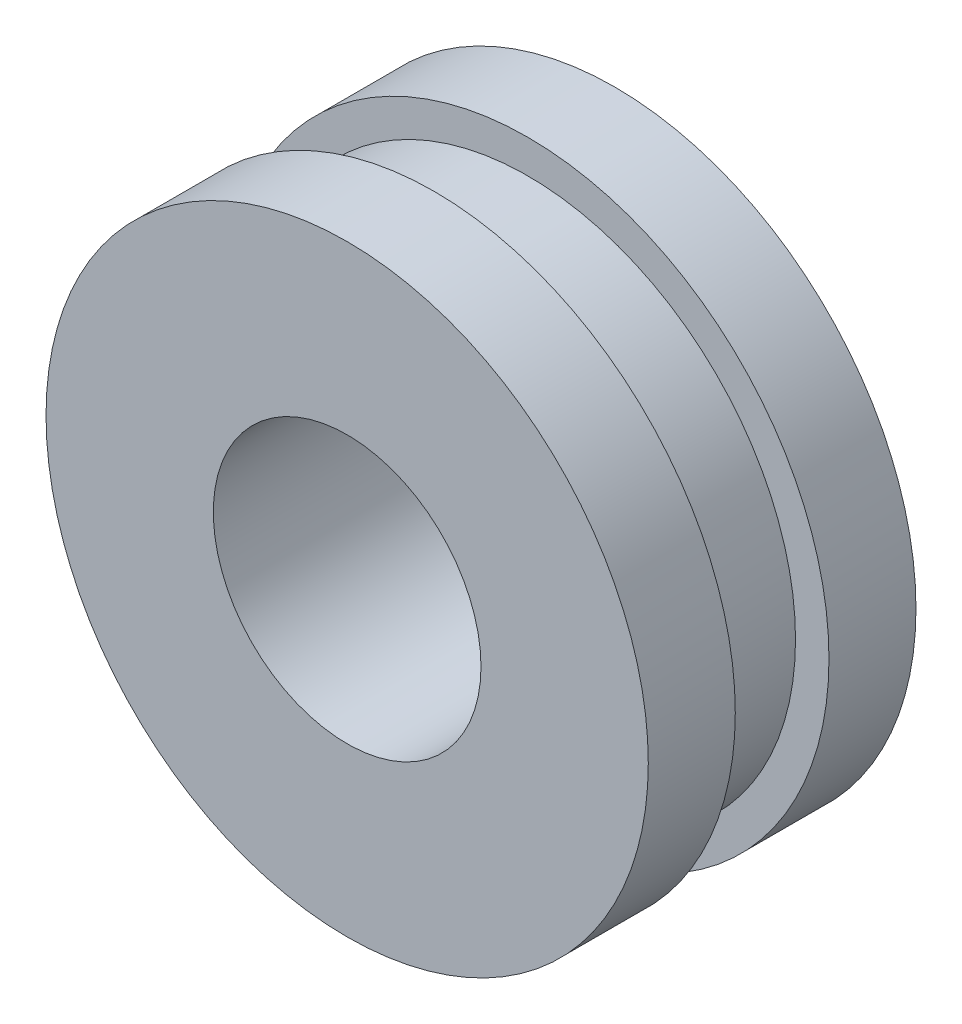
ISO-10303-21;
HEADER;
FILE_DESCRIPTION(('STEP AP214'),'2;1');
FILE_NAME('part.step','',(''),(''),'','','');
FILE_SCHEMA(('AUTOMOTIVE_DESIGN { 1 0 10303 214 1 1 1 1 }'));
ENDSEC;
DATA;
#1=APPLICATION_CONTEXT('core data for automotive mechanical design processes');
#2=APPLICATION_PROTOCOL_DEFINITION('international standard','automotive_design',2000,#1);
#3=PRODUCT_CONTEXT('',#1,'mechanical');
#4=PRODUCT('Part','Part','',(#3));
#5=PRODUCT_RELATED_PRODUCT_CATEGORY('part','',(#4));
#6=PRODUCT_DEFINITION_FORMATION('','',#4);
#7=PRODUCT_DEFINITION_CONTEXT('part definition',#1,'design');
#8=PRODUCT_DEFINITION('design','',#6,#7);
#9=PRODUCT_DEFINITION_SHAPE('','',#8);
#10=(LENGTH_UNIT() NAMED_UNIT(*) SI_UNIT(.MILLI.,.METRE.));
#11=(NAMED_UNIT(*) PLANE_ANGLE_UNIT() SI_UNIT($,.RADIAN.));
#12=(NAMED_UNIT(*) SI_UNIT($,.STERADIAN.) SOLID_ANGLE_UNIT());
#13=UNCERTAINTY_MEASURE_WITH_UNIT(LENGTH_MEASURE(1.E-05),#10,'distance_accuracy_value','');
#14=(GEOMETRIC_REPRESENTATION_CONTEXT(3) GLOBAL_UNCERTAINTY_ASSIGNED_CONTEXT((#13)) GLOBAL_UNIT_ASSIGNED_CONTEXT((#10,
#11,#12)) REPRESENTATION_CONTEXT('',''));
#15=CARTESIAN_POINT('',(0.,0.,0.));
#16=DIRECTION('',(0.,0.,1.));
#17=DIRECTION('',(1.,0.,0.));
#18=AXIS2_PLACEMENT_3D('',#15,#16,#17);
#19=CARTESIAN_POINT('',(0.,0.,-1.4));
#20=DIRECTION('',(0.,0.,1.));
#21=DIRECTION('',(1.,0.,0.));
#22=AXIS2_PLACEMENT_3D('',#19,#20,#21);
#23=CYLINDRICAL_SURFACE('',#22,4.);
#24=CARTESIAN_POINT('',(0.,0.,-1.4));
#25=DIRECTION('',(0.,0.,1.));
#26=DIRECTION('',(1.,0.,0.));
#27=AXIS2_PLACEMENT_3D('',#24,#25,#26);
#28=CIRCLE('',#27,4.);
#29=CARTESIAN_POINT('',(4.,0.,-1.4));
#30=VERTEX_POINT('',#29);
#31=EDGE_CURVE('E19',#30,#30,#28,.T.);
#32=ORIENTED_EDGE('',*,*,#31,.T.);
#33=EDGE_LOOP('',(#32));
#34=FACE_BOUND('',#33,.T.);
#35=CARTESIAN_POINT('',(0.,0.,0.));
#36=DIRECTION('',(0.,0.,1.));
#37=DIRECTION('',(1.,0.,0.));
#38=AXIS2_PLACEMENT_3D('',#35,#36,#37);
#39=CIRCLE('',#38,4.);
#40=CARTESIAN_POINT('',(4.,0.,0.));
#41=VERTEX_POINT('',#40);
#42=EDGE_CURVE('E41',#41,#41,#39,.F.);
#43=ORIENTED_EDGE('',*,*,#42,.T.);
#44=EDGE_LOOP('',(#43));
#45=FACE_BOUND('',#44,.T.);
#46=ADVANCED_FACE('F15',(#34,#45),#23,.T.);
#47=CARTESIAN_POINT('',(4.554,-4.554,-1.4));
#48=DIRECTION('',(0.,0.,-1.));
#49=DIRECTION('',(-1.,0.,0.));
#50=AXIS2_PLACEMENT_3D('',#47,#48,#49);
#51=PLANE('',#50);
#52=ORIENTED_EDGE('',*,*,#31,.F.);
#53=EDGE_LOOP('',(#52));
#54=FACE_BOUND('',#53,.T.);
#55=CARTESIAN_POINT('',(0.,0.,-1.4));
#56=DIRECTION('',(0.,0.,1.));
#57=DIRECTION('',(1.,0.,0.));
#58=AXIS2_PLACEMENT_3D('',#55,#56,#57);
#59=CIRCLE('',#58,4.5);
#60=CARTESIAN_POINT('',(4.5,0.,-1.4));
#61=VERTEX_POINT('',#60);
#62=EDGE_CURVE('E39',#61,#61,#59,.T.);
#63=ORIENTED_EDGE('',*,*,#62,.T.);
#64=EDGE_LOOP('',(#63));
#65=FACE_BOUND('',#64,.T.);
#66=ADVANCED_FACE('F49',(#54,#65),#51,.F.);
#67=CARTESIAN_POINT('',(-4.554,-4.554,0.));
#68=DIRECTION('',(0.,0.,1.));
#69=DIRECTION('',(1.,0.,0.));
#70=AXIS2_PLACEMENT_3D('',#67,#68,#69);
#71=PLANE('',#70);
#72=ORIENTED_EDGE('',*,*,#42,.F.);
#73=EDGE_LOOP('',(#72));
#74=FACE_BOUND('',#73,.T.);
#75=CARTESIAN_POINT('',(0.,0.,0.));
#76=DIRECTION('',(0.,0.,-1.));
#77=DIRECTION('',(-1.,0.,0.));
#78=AXIS2_PLACEMENT_3D('',#75,#76,#77);
#79=CIRCLE('',#78,4.5);
#80=CARTESIAN_POINT('',(-4.5,0.,0.));
#81=VERTEX_POINT('',#80);
#82=EDGE_CURVE('E36',#81,#81,#79,.T.);
#83=ORIENTED_EDGE('',*,*,#82,.T.);
#84=EDGE_LOOP('',(#83));
#85=FACE_BOUND('',#84,.T.);
#86=ADVANCED_FACE('F52',(#74,#85),#71,.F.);
#87=CARTESIAN_POINT('',(0.,0.,-2.7));
#88=DIRECTION('',(0.,0.,1.));
#89=DIRECTION('',(1.,0.,0.));
#90=AXIS2_PLACEMENT_3D('',#87,#88,#89);
#91=CYLINDRICAL_SURFACE('',#90,4.5);
#92=ORIENTED_EDGE('',*,*,#62,.F.);
#93=EDGE_LOOP('',(#92));
#94=FACE_BOUND('',#93,.T.);
#95=CARTESIAN_POINT('',(0.,0.,-2.7));
#96=DIRECTION('',(0.,0.,1.));
#97=DIRECTION('',(1.,0.,0.));
#98=AXIS2_PLACEMENT_3D('',#95,#96,#97);
#99=CIRCLE('',#98,4.5);
#100=CARTESIAN_POINT('',(4.5,0.,-2.7));
#101=VERTEX_POINT('',#100);
#102=EDGE_CURVE('E33',#101,#101,#99,.F.);
#103=ORIENTED_EDGE('',*,*,#102,.F.);
#104=EDGE_LOOP('',(#103));
#105=FACE_BOUND('',#104,.T.);
#106=ADVANCED_FACE('F56',(#94,#105),#91,.T.);
#107=CARTESIAN_POINT('',(0.,0.,1.3));
#108=DIRECTION('',(0.,0.,-1.));
#109=DIRECTION('',(-1.,0.,0.));
#110=AXIS2_PLACEMENT_3D('',#107,#108,#109);
#111=CYLINDRICAL_SURFACE('',#110,4.5);
#112=ORIENTED_EDGE('',*,*,#82,.F.);
#113=EDGE_LOOP('',(#112));
#114=FACE_BOUND('',#113,.T.);
#115=CARTESIAN_POINT('',(0.,0.,1.3));
#116=DIRECTION('',(0.,0.,-1.));
#117=DIRECTION('',(-1.,0.,0.));
#118=AXIS2_PLACEMENT_3D('',#115,#116,#117);
#119=CIRCLE('',#118,4.5);
#120=CARTESIAN_POINT('',(-4.5,0.,1.3));
#121=VERTEX_POINT('',#120);
#122=EDGE_CURVE('E28',#121,#121,#119,.F.);
#123=ORIENTED_EDGE('',*,*,#122,.F.);
#124=EDGE_LOOP('',(#123));
#125=FACE_BOUND('',#124,.T.);
#126=ADVANCED_FACE('F59',(#114,#125),#111,.T.);
#127=CARTESIAN_POINT('',(4.554,-4.554,-2.7));
#128=DIRECTION('',(0.,0.,-1.));
#129=DIRECTION('',(-1.,0.,0.));
#130=AXIS2_PLACEMENT_3D('',#127,#128,#129);
#131=PLANE('',#130);
#132=CARTESIAN_POINT('',(0.,0.,-2.7));
#133=DIRECTION('',(0.,0.,1.));
#134=DIRECTION('',(1.,0.,0.));
#135=AXIS2_PLACEMENT_3D('',#132,#133,#134);
#136=CIRCLE('',#135,2.);
#137=CARTESIAN_POINT('',(2.,0.,-2.7));
#138=VERTEX_POINT('',#137);
#139=EDGE_CURVE('E23',#138,#138,#136,.F.);
#140=ORIENTED_EDGE('',*,*,#139,.F.);
#141=EDGE_LOOP('',(#140));
#142=FACE_BOUND('',#141,.T.);
#143=ORIENTED_EDGE('',*,*,#102,.T.);
#144=EDGE_LOOP('',(#143));
#145=FACE_BOUND('',#144,.T.);
#146=ADVANCED_FACE('F63',(#142,#145),#131,.T.);
#147=CARTESIAN_POINT('',(-4.554,-4.554,1.3));
#148=DIRECTION('',(0.,0.,1.));
#149=DIRECTION('',(1.,0.,0.));
#150=AXIS2_PLACEMENT_3D('',#147,#148,#149);
#151=PLANE('',#150);
#152=CARTESIAN_POINT('',(0.,0.,1.3));
#153=DIRECTION('',(0.,0.,1.));
#154=DIRECTION('',(1.,0.,0.));
#155=AXIS2_PLACEMENT_3D('',#152,#153,#154);
#156=CIRCLE('',#155,2.);
#157=CARTESIAN_POINT('',(2.,0.,1.3));
#158=VERTEX_POINT('',#157);
#159=EDGE_CURVE('E10',#158,#158,#156,.T.);
#160=ORIENTED_EDGE('',*,*,#159,.F.);
#161=EDGE_LOOP('',(#160));
#162=FACE_BOUND('',#161,.T.);
#163=ORIENTED_EDGE('',*,*,#122,.T.);
#164=EDGE_LOOP('',(#163));
#165=FACE_BOUND('',#164,.T.);
#166=ADVANCED_FACE('F17',(#162,#165),#151,.T.);
#167=CARTESIAN_POINT('',(0.,0.,-2.7));
#168=DIRECTION('',(0.,0.,1.));
#169=DIRECTION('',(1.,0.,0.));
#170=AXIS2_PLACEMENT_3D('',#167,#168,#169);
#171=CYLINDRICAL_SURFACE('',#170,2.);
#172=ORIENTED_EDGE('',*,*,#159,.T.);
#173=EDGE_LOOP('',(#172));
#174=FACE_BOUND('',#173,.T.);
#175=ORIENTED_EDGE('',*,*,#139,.T.);
#176=EDGE_LOOP('',(#175));
#177=FACE_BOUND('',#176,.T.);
#178=ADVANCED_FACE('F71',(#174,#177),#171,.F.);
#179=CLOSED_SHELL('',(#46,#66,#86,#106,#126,#146,#166,#178));
#180=MANIFOLD_SOLID_BREP('B1',#179);
#181=ADVANCED_BREP_SHAPE_REPRESENTATION('',(#18,#180),#14);
#182=SHAPE_DEFINITION_REPRESENTATION(#9,#181);
ENDSEC;
END-ISO-10303-21;
